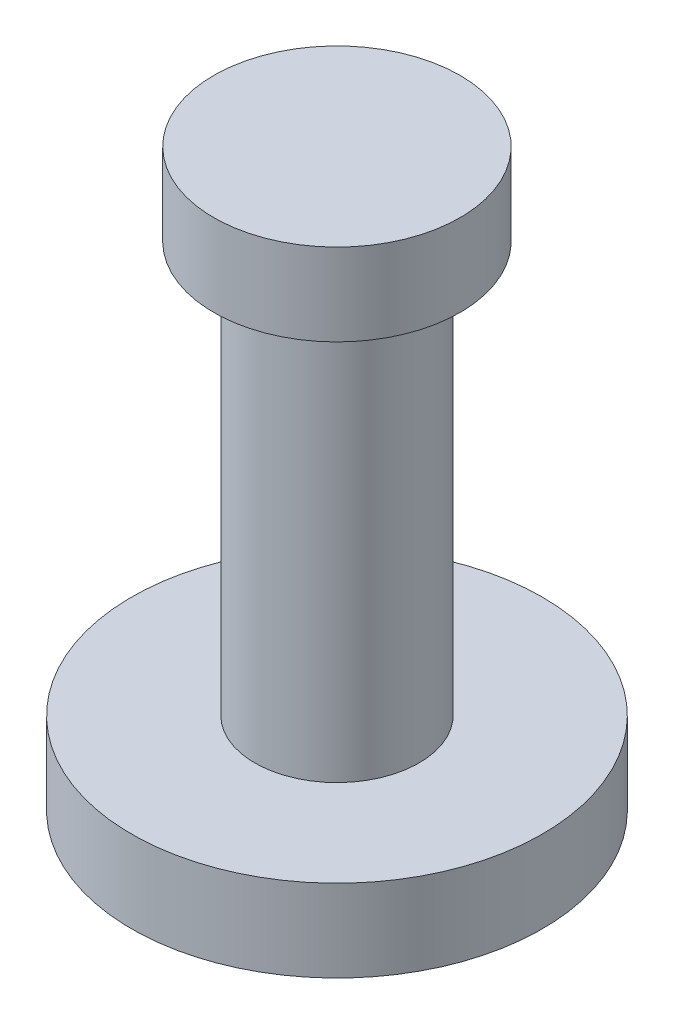
ISO-10303-21;
HEADER;
FILE_DESCRIPTION(('STEP AP214'),'2;1');
FILE_NAME('part.step','',(''),(''),'','','');
FILE_SCHEMA(('AUTOMOTIVE_DESIGN { 1 0 10303 214 1 1 1 1 }'));
ENDSEC;
DATA;
#1=APPLICATION_CONTEXT('core data for automotive mechanical design processes');
#2=APPLICATION_PROTOCOL_DEFINITION('international standard','automotive_design',2000,#1);
#3=PRODUCT_CONTEXT('',#1,'mechanical');
#4=PRODUCT('Part','Part','',(#3));
#5=PRODUCT_RELATED_PRODUCT_CATEGORY('part','',(#4));
#6=PRODUCT_DEFINITION_FORMATION('','',#4);
#7=PRODUCT_DEFINITION_CONTEXT('part definition',#1,'design');
#8=PRODUCT_DEFINITION('design','',#6,#7);
#9=PRODUCT_DEFINITION_SHAPE('','',#8);
#10=(LENGTH_UNIT() NAMED_UNIT(*) SI_UNIT(.MILLI.,.METRE.));
#11=(NAMED_UNIT(*) PLANE_ANGLE_UNIT() SI_UNIT($,.RADIAN.));
#12=(NAMED_UNIT(*) SI_UNIT($,.STERADIAN.) SOLID_ANGLE_UNIT());
#13=UNCERTAINTY_MEASURE_WITH_UNIT(LENGTH_MEASURE(1.E-05),#10,'distance_accuracy_value','');
#14=(GEOMETRIC_REPRESENTATION_CONTEXT(3) GLOBAL_UNCERTAINTY_ASSIGNED_CONTEXT((#13)) GLOBAL_UNIT_ASSIGNED_CONTEXT((#10,
#11,#12)) REPRESENTATION_CONTEXT('',''));
#15=CARTESIAN_POINT('',(0.,0.,0.));
#16=DIRECTION('',(0.,0.,1.));
#17=DIRECTION('',(1.,0.,0.));
#18=AXIS2_PLACEMENT_3D('',#15,#16,#17);
#19=CARTESIAN_POINT('',(-17.4214686201032,-10.,0.));
#20=DIRECTION('',(0.,-1.,0.));
#21=DIRECTION('',(0.,0.,-1.));
#22=AXIS2_PLACEMENT_3D('',#19,#20,#21);
#23=CYLINDRICAL_SURFACE('',#22,25.);
#24=CARTESIAN_POINT('',(-17.4214686201032,-10.,0.));
#25=DIRECTION('',(0.,-1.,0.));
#26=DIRECTION('',(0.,0.,-1.));
#27=AXIS2_PLACEMENT_3D('',#24,#25,#26);
#28=CIRCLE('',#27,25.);
#29=CARTESIAN_POINT('',(-17.4214686201032,-10.,-25.));
#30=VERTEX_POINT('',#29);
#31=EDGE_CURVE('E10',#30,#30,#28,.T.);
#32=ORIENTED_EDGE('',*,*,#31,.F.);
#33=EDGE_LOOP('',(#32));
#34=FACE_BOUND('',#33,.T.);
#35=CARTESIAN_POINT('',(-17.4214686201032,0.,0.));
#36=DIRECTION('',(0.,-1.,0.));
#37=DIRECTION('',(0.,0.,-1.));
#38=AXIS2_PLACEMENT_3D('',#35,#36,#37);
#39=CIRCLE('',#38,25.);
#40=CARTESIAN_POINT('',(-17.4214686201032,0.,-25.));
#41=VERTEX_POINT('',#40);
#42=EDGE_CURVE('E66',#41,#41,#39,.T.);
#43=ORIENTED_EDGE('',*,*,#42,.T.);
#44=EDGE_LOOP('',(#43));
#45=FACE_BOUND('',#44,.T.);
#46=ADVANCED_FACE('F39',(#34,#45),#23,.T.);
#47=CARTESIAN_POINT('',(-42.4214686201032,-10.,0.));
#48=DIRECTION('',(0.,1.,0.));
#49=DIRECTION('',(0.,0.,1.));
#50=AXIS2_PLACEMENT_3D('',#47,#48,#49);
#51=PLANE('',#50);
#52=ORIENTED_EDGE('',*,*,#31,.T.);
#53=EDGE_LOOP('',(#52));
#54=FACE_BOUND('',#53,.T.);
#55=ADVANCED_FACE('F97',(#54),#51,.F.);
#56=CARTESIAN_POINT('',(-17.4214686201032,60.,0.));
#57=DIRECTION('',(0.,-1.,0.));
#58=DIRECTION('',(0.,0.,-1.));
#59=AXIS2_PLACEMENT_3D('',#56,#57,#58);
#60=PLANE('',#59);
#61=CARTESIAN_POINT('',(-17.4214686201032,60.,0.));
#62=DIRECTION('',(0.,-1.,0.));
#63=DIRECTION('',(0.,0.,-1.));
#64=AXIS2_PLACEMENT_3D('',#61,#62,#63);
#65=CIRCLE('',#64,15.);
#66=CARTESIAN_POINT('',(-17.4214686201032,60.,-15.));
#67=VERTEX_POINT('',#66);
#68=EDGE_CURVE('E46',#67,#67,#65,.T.);
#69=ORIENTED_EDGE('',*,*,#68,.F.);
#70=EDGE_LOOP('',(#69));
#71=FACE_BOUND('',#70,.T.);
#72=ADVANCED_FACE('F92',(#71),#60,.F.);
#73=CARTESIAN_POINT('',(-17.4214686201032,-10.,0.));
#74=DIRECTION('',(0.,-1.,0.));
#75=DIRECTION('',(0.,0.,-1.));
#76=AXIS2_PLACEMENT_3D('',#73,#74,#75);
#77=CYLINDRICAL_SURFACE('',#76,15.);
#78=CARTESIAN_POINT('',(-17.4214686201032,50.,0.));
#79=DIRECTION('',(0.,-1.,0.));
#80=DIRECTION('',(0.,0.,-1.));
#81=AXIS2_PLACEMENT_3D('',#78,#79,#80);
#82=CIRCLE('',#81,15.);
#83=CARTESIAN_POINT('',(-17.4214686201032,50.,-15.));
#84=VERTEX_POINT('',#83);
#85=EDGE_CURVE('E51',#84,#84,#82,.T.);
#86=ORIENTED_EDGE('',*,*,#85,.F.);
#87=EDGE_LOOP('',(#86));
#88=FACE_BOUND('',#87,.T.);
#89=ORIENTED_EDGE('',*,*,#68,.T.);
#90=EDGE_LOOP('',(#89));
#91=FACE_BOUND('',#90,.T.);
#92=ADVANCED_FACE('F87',(#88,#91),#77,.T.);
#93=CARTESIAN_POINT('',(-32.4214686201032,50.,0.));
#94=DIRECTION('',(0.,1.,0.));
#95=DIRECTION('',(0.,0.,1.));
#96=AXIS2_PLACEMENT_3D('',#93,#94,#95);
#97=PLANE('',#96);
#98=CARTESIAN_POINT('',(-17.4214686201032,50.,0.));
#99=DIRECTION('',(0.,-1.,0.));
#100=DIRECTION('',(0.,0.,-1.));
#101=AXIS2_PLACEMENT_3D('',#98,#99,#100);
#102=CIRCLE('',#101,10.);
#103=CARTESIAN_POINT('',(-17.4214686201032,50.,-10.));
#104=VERTEX_POINT('',#103);
#105=EDGE_CURVE('E56',#104,#104,#102,.T.);
#106=ORIENTED_EDGE('',*,*,#105,.F.);
#107=EDGE_LOOP('',(#106));
#108=FACE_BOUND('',#107,.T.);
#109=ORIENTED_EDGE('',*,*,#85,.T.);
#110=EDGE_LOOP('',(#109));
#111=FACE_BOUND('',#110,.T.);
#112=ADVANCED_FACE('F81',(#108,#111),#97,.F.);
#113=CARTESIAN_POINT('',(-17.4214686201032,-10.,0.));
#114=DIRECTION('',(0.,-1.,0.));
#115=DIRECTION('',(0.,0.,-1.));
#116=AXIS2_PLACEMENT_3D('',#113,#114,#115);
#117=CYLINDRICAL_SURFACE('',#116,10.);
#118=CARTESIAN_POINT('',(-17.4214686201032,0.,0.));
#119=DIRECTION('',(0.,-1.,0.));
#120=DIRECTION('',(0.,0.,-1.));
#121=AXIS2_PLACEMENT_3D('',#118,#119,#120);
#122=CIRCLE('',#121,9.99999999999999);
#123=CARTESIAN_POINT('',(-17.4214686201032,0.,-9.99999999999999));
#124=VERTEX_POINT('',#123);
#125=EDGE_CURVE('E62',#124,#124,#122,.T.);
#126=ORIENTED_EDGE('',*,*,#125,.F.);
#127=EDGE_LOOP('',(#126));
#128=FACE_BOUND('',#127,.T.);
#129=ORIENTED_EDGE('',*,*,#105,.T.);
#130=EDGE_LOOP('',(#129));
#131=FACE_BOUND('',#130,.T.);
#132=ADVANCED_FACE('F75',(#128,#131),#117,.T.);
#133=CARTESIAN_POINT('',(-27.4214686201032,0.,0.));
#134=DIRECTION('',(0.,-1.,0.));
#135=DIRECTION('',(0.,0.,-1.));
#136=AXIS2_PLACEMENT_3D('',#133,#134,#135);
#137=PLANE('',#136);
#138=ORIENTED_EDGE('',*,*,#42,.F.);
#139=EDGE_LOOP('',(#138));
#140=FACE_BOUND('',#139,.T.);
#141=ORIENTED_EDGE('',*,*,#125,.T.);
#142=EDGE_LOOP('',(#141));
#143=FACE_BOUND('',#142,.T.);
#144=ADVANCED_FACE('F72',(#140,#143),#137,.F.);
#145=CLOSED_SHELL('',(#46,#55,#72,#92,#112,#132,#144));
#146=MANIFOLD_SOLID_BREP('B2',#145);
#147=ADVANCED_BREP_SHAPE_REPRESENTATION('',(#18,#146),#14);
#148=SHAPE_DEFINITION_REPRESENTATION(#9,#147);
ENDSEC;
END-ISO-10303-21;
